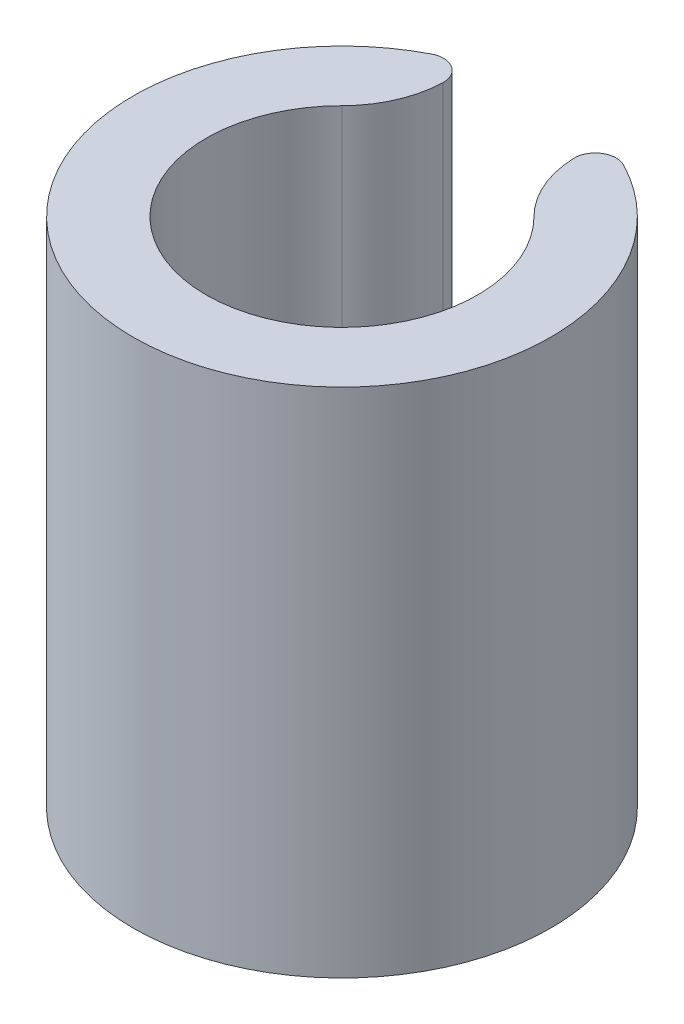
ISO-10303-21;
HEADER;
FILE_DESCRIPTION(('STEP AP214'),'2;1');
FILE_NAME('part.step','',(''),(''),'','','');
FILE_SCHEMA(('AUTOMOTIVE_DESIGN { 1 0 10303 214 1 1 1 1 }'));
ENDSEC;
DATA;
#1=APPLICATION_CONTEXT('core data for automotive mechanical design processes');
#2=APPLICATION_PROTOCOL_DEFINITION('international standard','automotive_design',2000,#1);
#3=PRODUCT_CONTEXT('',#1,'mechanical');
#4=PRODUCT('Part','Part','',(#3));
#5=PRODUCT_RELATED_PRODUCT_CATEGORY('part','',(#4));
#6=PRODUCT_DEFINITION_FORMATION('','',#4);
#7=PRODUCT_DEFINITION_CONTEXT('part definition',#1,'design');
#8=PRODUCT_DEFINITION('design','',#6,#7);
#9=PRODUCT_DEFINITION_SHAPE('','',#8);
#10=(LENGTH_UNIT() NAMED_UNIT(*) SI_UNIT(.MILLI.,.METRE.));
#11=(NAMED_UNIT(*) PLANE_ANGLE_UNIT() SI_UNIT($,.RADIAN.));
#12=(NAMED_UNIT(*) SI_UNIT($,.STERADIAN.) SOLID_ANGLE_UNIT());
#13=UNCERTAINTY_MEASURE_WITH_UNIT(LENGTH_MEASURE(1.E-05),#10,'distance_accuracy_value','');
#14=(GEOMETRIC_REPRESENTATION_CONTEXT(3) GLOBAL_UNCERTAINTY_ASSIGNED_CONTEXT((#13)) GLOBAL_UNIT_ASSIGNED_CONTEXT((#10,
#11,#12)) REPRESENTATION_CONTEXT('',''));
#15=CARTESIAN_POINT('',(0.,0.,0.));
#16=DIRECTION('',(0.,0.,1.));
#17=DIRECTION('',(1.,0.,0.));
#18=AXIS2_PLACEMENT_3D('',#15,#16,#17);
#19=CARTESIAN_POINT('',(0.,9.8,0.));
#20=DIRECTION('',(0.,1.,0.));
#21=DIRECTION('',(0.,0.,1.));
#22=AXIS2_PLACEMENT_3D('',#19,#20,#21);
#23=PLANE('',#22);
#24=CARTESIAN_POINT('',(0.,9.8,0.));
#25=DIRECTION('',(0.,1.,0.));
#26=DIRECTION('',(0.,0.,1.));
#27=AXIS2_PLACEMENT_3D('',#24,#25,#26);
#28=CIRCLE('',#27,4.);
#29=CARTESIAN_POINT('',(-1.83737264657326,9.8,-3.55303556942854));
#30=VERTEX_POINT('',#29);
#31=CARTESIAN_POINT('',(1.83737264657326,9.8,-3.55303556942854));
#32=VERTEX_POINT('',#31);
#33=EDGE_CURVE('E117',#30,#32,#28,.T.);
#34=ORIENTED_EDGE('',*,*,#33,.T.);
#35=CARTESIAN_POINT('',(1.65363538191594,9.8,-3.19773201248568));
#36=DIRECTION('',(0.,1.,0.));
#37=DIRECTION('',(0.,0.,1.));
#38=AXIS2_PLACEMENT_3D('',#35,#36,#37);
#39=CIRCLE('',#38,0.4);
#40=CARTESIAN_POINT('',(1.25387142903039,9.8,-3.18399221724257));
#41=VERTEX_POINT('',#40);
#42=EDGE_CURVE('E129',#32,#41,#39,.T.);
#43=ORIENTED_EDGE('',*,*,#42,.T.);
#44=CARTESIAN_POINT('',(3.25269119345812,9.8,-3.25269119345811));
#45=DIRECTION('',(0.,-1.,0.));
#46=DIRECTION('',(0.,0.,-1.));
#47=AXIS2_PLACEMENT_3D('',#44,#45,#46);
#48=CIRCLE('',#47,2.);
#49=CARTESIAN_POINT('',(1.83847763108503,9.8,-1.83847763108502));
#50=VERTEX_POINT('',#49);
#51=EDGE_CURVE('E142',#50,#41,#48,.T.);
#52=ORIENTED_EDGE('',*,*,#51,.F.);
#53=CARTESIAN_POINT('',(0.,9.8,0.));
#54=DIRECTION('',(0.,1.,0.));
#55=DIRECTION('',(0.,0.,1.));
#56=AXIS2_PLACEMENT_3D('',#53,#54,#55);
#57=CIRCLE('',#56,2.6);
#58=CARTESIAN_POINT('',(-1.83847763108503,9.8,-1.83847763108502));
#59=VERTEX_POINT('',#58);
#60=EDGE_CURVE('E111',#59,#50,#57,.T.);
#61=ORIENTED_EDGE('',*,*,#60,.F.);
#62=CARTESIAN_POINT('',(-3.25269119345812,9.8,-3.25269119345811));
#63=DIRECTION('',(0.,-1.,0.));
#64=DIRECTION('',(0.,0.,1.));
#65=AXIS2_PLACEMENT_3D('',#62,#63,#64);
#66=CIRCLE('',#65,2.);
#67=CARTESIAN_POINT('',(-1.25387142903039,9.8,-3.18399221724257));
#68=VERTEX_POINT('',#67);
#69=EDGE_CURVE('E104',#68,#59,#66,.T.);
#70=ORIENTED_EDGE('',*,*,#69,.F.);
#71=CARTESIAN_POINT('',(-1.65363538191594,9.8,-3.19773201248568));
#72=DIRECTION('',(0.,1.,0.));
#73=DIRECTION('',(0.,0.,1.));
#74=AXIS2_PLACEMENT_3D('',#71,#72,#73);
#75=CIRCLE('',#74,0.4);
#76=EDGE_CURVE('E127',#68,#30,#75,.T.);
#77=ORIENTED_EDGE('',*,*,#76,.T.);
#78=EDGE_LOOP('',(#34,#43,#52,#61,#70,#77));
#79=FACE_BOUND('',#78,.T.);
#80=ADVANCED_FACE('F37',(#79),#23,.T.);
#81=CARTESIAN_POINT('',(0.,0.,0.));
#82=DIRECTION('',(0.,1.,0.));
#83=DIRECTION('',(0.,0.,1.));
#84=AXIS2_PLACEMENT_3D('',#81,#82,#83);
#85=PLANE('',#84);
#86=CARTESIAN_POINT('',(3.25269119345812,0.,-3.25269119345811));
#87=DIRECTION('',(0.,-1.,0.));
#88=DIRECTION('',(0.,0.,-1.));
#89=AXIS2_PLACEMENT_3D('',#86,#87,#88);
#90=CIRCLE('',#89,2.);
#91=CARTESIAN_POINT('',(1.83847763108503,0.,-1.83847763108502));
#92=VERTEX_POINT('',#91);
#93=CARTESIAN_POINT('',(1.25387142903039,0.,-3.18399221724257));
#94=VERTEX_POINT('',#93);
#95=EDGE_CURVE('E98',#92,#94,#90,.T.);
#96=ORIENTED_EDGE('',*,*,#95,.T.);
#97=CARTESIAN_POINT('',(1.65363538191594,0.,-3.19773201248568));
#98=DIRECTION('',(0.,1.,0.));
#99=DIRECTION('',(0.,0.,1.));
#100=AXIS2_PLACEMENT_3D('',#97,#98,#99);
#101=CIRCLE('',#100,0.4);
#102=CARTESIAN_POINT('',(1.83737264657326,0.,-3.55303556942854));
#103=VERTEX_POINT('',#102);
#104=EDGE_CURVE('E45',#94,#103,#101,.F.);
#105=ORIENTED_EDGE('',*,*,#104,.T.);
#106=CARTESIAN_POINT('',(0.,0.,0.));
#107=DIRECTION('',(0.,1.,0.));
#108=DIRECTION('',(0.,0.,1.));
#109=AXIS2_PLACEMENT_3D('',#106,#107,#108);
#110=CIRCLE('',#109,4.);
#111=CARTESIAN_POINT('',(-1.83737264657326,0.,-3.55303556942854));
#112=VERTEX_POINT('',#111);
#113=EDGE_CURVE('E113',#112,#103,#110,.T.);
#114=ORIENTED_EDGE('',*,*,#113,.F.);
#115=CARTESIAN_POINT('',(-1.65363538191594,0.,-3.19773201248568));
#116=DIRECTION('',(0.,1.,0.));
#117=DIRECTION('',(0.,0.,1.));
#118=AXIS2_PLACEMENT_3D('',#115,#116,#117);
#119=CIRCLE('',#118,0.4);
#120=CARTESIAN_POINT('',(-1.25387142903039,0.,-3.18399221724257));
#121=VERTEX_POINT('',#120);
#122=EDGE_CURVE('E52',#112,#121,#119,.F.);
#123=ORIENTED_EDGE('',*,*,#122,.T.);
#124=CARTESIAN_POINT('',(-3.25269119345812,0.,-3.25269119345811));
#125=DIRECTION('',(0.,-1.,0.));
#126=DIRECTION('',(0.,0.,1.));
#127=AXIS2_PLACEMENT_3D('',#124,#125,#126);
#128=CIRCLE('',#127,2.);
#129=CARTESIAN_POINT('',(-1.83847763108503,0.,-1.83847763108502));
#130=VERTEX_POINT('',#129);
#131=EDGE_CURVE('E90',#121,#130,#128,.T.);
#132=ORIENTED_EDGE('',*,*,#131,.T.);
#133=CARTESIAN_POINT('',(0.,0.,0.));
#134=DIRECTION('',(0.,1.,0.));
#135=DIRECTION('',(0.,0.,1.));
#136=AXIS2_PLACEMENT_3D('',#133,#134,#135);
#137=CIRCLE('',#136,2.6);
#138=EDGE_CURVE('E94',#130,#92,#137,.T.);
#139=ORIENTED_EDGE('',*,*,#138,.T.);
#140=EDGE_LOOP('',(#96,#105,#114,#123,#132,#139));
#141=FACE_BOUND('',#140,.T.);
#142=ADVANCED_FACE('F92',(#141),#85,.F.);
#143=CARTESIAN_POINT('',(0.,9.8,0.));
#144=DIRECTION('',(0.,-1.,0.));
#145=DIRECTION('',(0.,0.,-1.));
#146=AXIS2_PLACEMENT_3D('',#143,#144,#145);
#147=CYLINDRICAL_SURFACE('',#146,2.6);
#148=ORIENTED_EDGE('',*,*,#138,.F.);
#149=DIRECTION('',(0.,1.,0.));
#150=VECTOR('',#149,1.);
#151=CARTESIAN_POINT('',(-1.83847763108503,0.,-1.83847763108502));
#152=LINE('',#151,#150);
#153=EDGE_CURVE('E101',#130,#59,#152,.T.);
#154=ORIENTED_EDGE('',*,*,#153,.T.);
#155=ORIENTED_EDGE('',*,*,#60,.T.);
#156=DIRECTION('',(0.,1.,0.));
#157=VECTOR('',#156,1.);
#158=CARTESIAN_POINT('',(1.83847763108503,0.,-1.83847763108502));
#159=LINE('',#158,#157);
#160=EDGE_CURVE('E97',#92,#50,#159,.T.);
#161=ORIENTED_EDGE('',*,*,#160,.F.);
#162=EDGE_LOOP('',(#148,#154,#155,#161));
#163=FACE_BOUND('',#162,.T.);
#164=ADVANCED_FACE('F110',(#163),#147,.F.);
#165=CARTESIAN_POINT('',(0.,9.8,0.));
#166=DIRECTION('',(0.,-1.,0.));
#167=DIRECTION('',(0.,0.,-1.));
#168=AXIS2_PLACEMENT_3D('',#165,#166,#167);
#169=CYLINDRICAL_SURFACE('',#168,4.);
#170=ORIENTED_EDGE('',*,*,#113,.T.);
#171=DIRECTION('',(0.,-1.,0.));
#172=VECTOR('',#171,1.);
#173=CARTESIAN_POINT('',(1.83737264657326,9.8,-3.55303556942854));
#174=LINE('',#173,#172);
#175=EDGE_CURVE('E124',#103,#32,#174,.F.);
#176=ORIENTED_EDGE('',*,*,#175,.T.);
#177=ORIENTED_EDGE('',*,*,#33,.F.);
#178=DIRECTION('',(0.,-1.,0.));
#179=VECTOR('',#178,1.);
#180=CARTESIAN_POINT('',(-1.83737264657326,9.8,-3.55303556942854));
#181=LINE('',#180,#179);
#182=EDGE_CURVE('E120',#30,#112,#181,.T.);
#183=ORIENTED_EDGE('',*,*,#182,.T.);
#184=EDGE_LOOP('',(#170,#176,#177,#183));
#185=FACE_BOUND('',#184,.T.);
#186=ADVANCED_FACE('F136',(#185),#169,.T.);
#187=CARTESIAN_POINT('',(3.25269119345812,0.,-3.25269119345811));
#188=DIRECTION('',(0.,1.,0.));
#189=DIRECTION('',(0.,0.,1.));
#190=AXIS2_PLACEMENT_3D('',#187,#188,#189);
#191=CYLINDRICAL_SURFACE('',#190,2.);
#192=ORIENTED_EDGE('',*,*,#51,.T.);
#193=DIRECTION('',(0.,1.,0.));
#194=VECTOR('',#193,1.);
#195=CARTESIAN_POINT('',(1.25387142903039,0.,-3.18399221724257));
#196=LINE('',#195,#194);
#197=EDGE_CURVE('E60',#41,#94,#196,.F.);
#198=ORIENTED_EDGE('',*,*,#197,.T.);
#199=ORIENTED_EDGE('',*,*,#95,.F.);
#200=ORIENTED_EDGE('',*,*,#160,.T.);
#201=EDGE_LOOP('',(#192,#198,#199,#200));
#202=FACE_BOUND('',#201,.T.);
#203=ADVANCED_FACE('F143',(#202),#191,.T.);
#204=CARTESIAN_POINT('',(-3.25269119345812,0.,-3.25269119345811));
#205=DIRECTION('',(0.,1.,0.));
#206=DIRECTION('',(0.,0.,1.));
#207=AXIS2_PLACEMENT_3D('',#204,#205,#206);
#208=CYLINDRICAL_SURFACE('',#207,2.);
#209=ORIENTED_EDGE('',*,*,#131,.F.);
#210=DIRECTION('',(0.,1.,0.));
#211=VECTOR('',#210,1.);
#212=CARTESIAN_POINT('',(-1.25387142903039,0.,-3.18399221724257));
#213=LINE('',#212,#211);
#214=EDGE_CURVE('E11',#121,#68,#213,.T.);
#215=ORIENTED_EDGE('',*,*,#214,.T.);
#216=ORIENTED_EDGE('',*,*,#69,.T.);
#217=ORIENTED_EDGE('',*,*,#153,.F.);
#218=EDGE_LOOP('',(#209,#215,#216,#217));
#219=FACE_BOUND('',#218,.T.);
#220=ADVANCED_FACE('F102',(#219),#208,.T.);
#221=CARTESIAN_POINT('',(1.65363538191594,0.,-3.19773201248568));
#222=DIRECTION('',(0.,1.,0.));
#223=DIRECTION('',(0.,0.,1.));
#224=AXIS2_PLACEMENT_3D('',#221,#222,#223);
#225=CYLINDRICAL_SURFACE('',#224,0.4);
#226=ORIENTED_EDGE('',*,*,#104,.F.);
#227=ORIENTED_EDGE('',*,*,#197,.F.);
#228=ORIENTED_EDGE('',*,*,#42,.F.);
#229=ORIENTED_EDGE('',*,*,#175,.F.);
#230=EDGE_LOOP('',(#226,#227,#228,#229));
#231=FACE_BOUND('',#230,.T.);
#232=ADVANCED_FACE('F139',(#231),#225,.T.);
#233=CARTESIAN_POINT('',(-1.65363538191594,9.8,-3.19773201248568));
#234=DIRECTION('',(0.,1.,0.));
#235=DIRECTION('',(0.,0.,1.));
#236=AXIS2_PLACEMENT_3D('',#233,#234,#235);
#237=CYLINDRICAL_SURFACE('',#236,0.4);
#238=ORIENTED_EDGE('',*,*,#122,.F.);
#239=ORIENTED_EDGE('',*,*,#182,.F.);
#240=ORIENTED_EDGE('',*,*,#76,.F.);
#241=ORIENTED_EDGE('',*,*,#214,.F.);
#242=EDGE_LOOP('',(#238,#239,#240,#241));
#243=FACE_BOUND('',#242,.T.);
#244=ADVANCED_FACE('F39',(#243),#237,.T.);
#245=CLOSED_SHELL('',(#80,#142,#164,#186,#203,#220,#232,#244));
#246=MANIFOLD_SOLID_BREP('B2',#245);
#247=ADVANCED_BREP_SHAPE_REPRESENTATION('',(#18,#246),#14);
#248=SHAPE_DEFINITION_REPRESENTATION(#9,#247);
ENDSEC;
END-ISO-10303-21;
